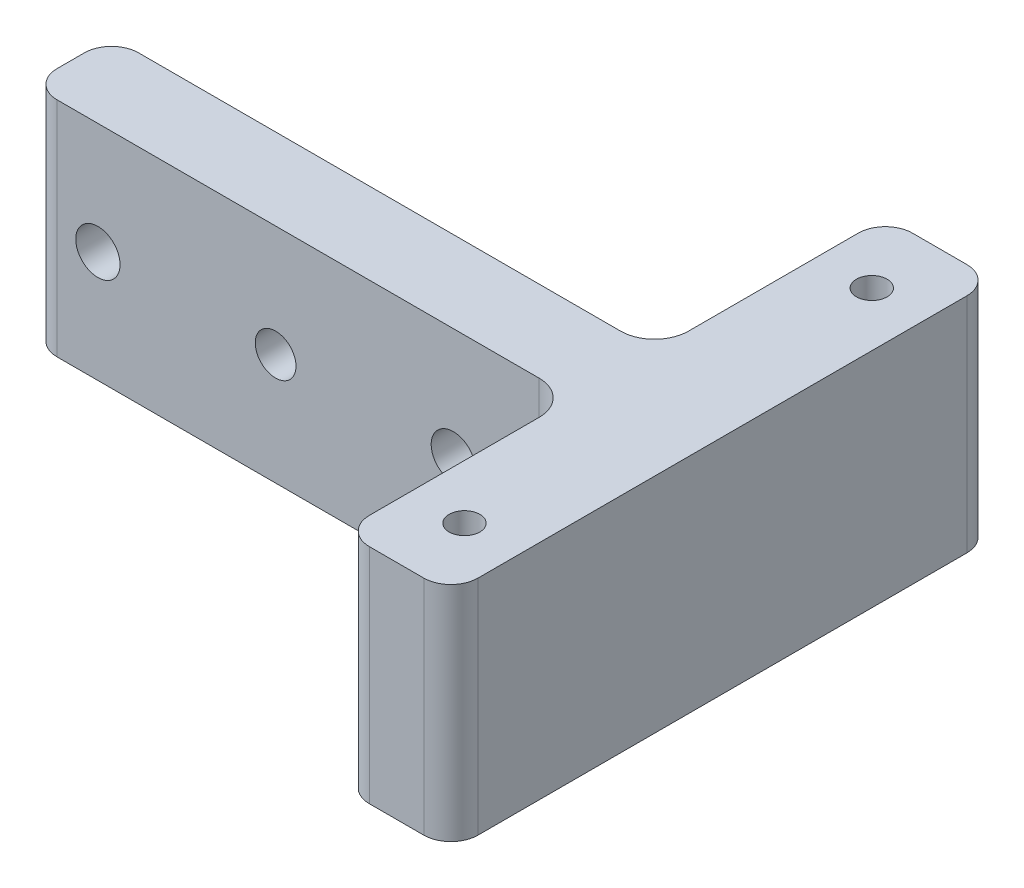
ISO-10303-21;
HEADER;
FILE_DESCRIPTION(('STEP AP214'),'2;1');
FILE_NAME('part.step','',(''),(''),'','','');
FILE_SCHEMA(('AUTOMOTIVE_DESIGN { 1 0 10303 214 1 1 1 1 }'));
ENDSEC;
DATA;
#1=APPLICATION_CONTEXT('core data for automotive mechanical design processes');
#2=APPLICATION_PROTOCOL_DEFINITION('international standard','automotive_design',2000,#1);
#3=PRODUCT_CONTEXT('',#1,'mechanical');
#4=PRODUCT('Part','Part','',(#3));
#5=PRODUCT_RELATED_PRODUCT_CATEGORY('part','',(#4));
#6=PRODUCT_DEFINITION_FORMATION('','',#4);
#7=PRODUCT_DEFINITION_CONTEXT('part definition',#1,'design');
#8=PRODUCT_DEFINITION('design','',#6,#7);
#9=PRODUCT_DEFINITION_SHAPE('','',#8);
#10=(LENGTH_UNIT() NAMED_UNIT(*) SI_UNIT(.MILLI.,.METRE.));
#11=(NAMED_UNIT(*) PLANE_ANGLE_UNIT() SI_UNIT($,.RADIAN.));
#12=(NAMED_UNIT(*) SI_UNIT($,.STERADIAN.) SOLID_ANGLE_UNIT());
#13=UNCERTAINTY_MEASURE_WITH_UNIT(LENGTH_MEASURE(1.E-05),#10,'distance_accuracy_value','');
#14=(GEOMETRIC_REPRESENTATION_CONTEXT(3) GLOBAL_UNCERTAINTY_ASSIGNED_CONTEXT((#13)) GLOBAL_UNIT_ASSIGNED_CONTEXT((#10,
#11,#12)) REPRESENTATION_CONTEXT('',''));
#15=CARTESIAN_POINT('',(0.,0.,0.));
#16=DIRECTION('',(0.,0.,1.));
#17=DIRECTION('',(1.,0.,0.));
#18=AXIS2_PLACEMENT_3D('',#15,#16,#17);
#19=CARTESIAN_POINT('',(4.,16.4,-20.));
#20=DIRECTION('',(-1.,0.,0.));
#21=DIRECTION('',(0.,0.,1.));
#22=AXIS2_PLACEMENT_3D('',#19,#20,#21);
#23=PLANE('',#22);
#24=DIRECTION('',(0.,0.,-1.));
#25=VECTOR('',#24,1.);
#26=CARTESIAN_POINT('',(4.,0.,-20.));
#27=LINE('',#26,#25);
#28=CARTESIAN_POINT('',(4.,0.,18.));
#29=VERTEX_POINT('',#28);
#30=CARTESIAN_POINT('',(4.,0.,-18.));
#31=VERTEX_POINT('',#30);
#32=EDGE_CURVE('E291',#29,#31,#27,.T.);
#33=ORIENTED_EDGE('',*,*,#32,.T.);
#34=DIRECTION('',(0.,-1.,0.));
#35=VECTOR('',#34,1.);
#36=CARTESIAN_POINT('',(4.,16.4,-18.));
#37=LINE('',#36,#35);
#38=CARTESIAN_POINT('',(4.,16.4,-18.));
#39=VERTEX_POINT('',#38);
#40=EDGE_CURVE('E243',#31,#39,#37,.F.);
#41=ORIENTED_EDGE('',*,*,#40,.T.);
#42=DIRECTION('',(0.,0.,-1.));
#43=VECTOR('',#42,1.);
#44=CARTESIAN_POINT('',(4.,16.4,-20.));
#45=LINE('',#44,#43);
#46=CARTESIAN_POINT('',(4.,16.4,18.));
#47=VERTEX_POINT('',#46);
#48=EDGE_CURVE('E192',#47,#39,#45,.T.);
#49=ORIENTED_EDGE('',*,*,#48,.F.);
#50=DIRECTION('',(0.,-1.,0.));
#51=VECTOR('',#50,1.);
#52=CARTESIAN_POINT('',(4.,16.4,18.));
#53=LINE('',#52,#51);
#54=EDGE_CURVE('E240',#47,#29,#53,.T.);
#55=ORIENTED_EDGE('',*,*,#54,.T.);
#56=EDGE_LOOP('',(#33,#41,#49,#55));
#57=FACE_BOUND('',#56,.T.);
#58=ADVANCED_FACE('F35',(#57),#23,.F.);
#59=CARTESIAN_POINT('',(-4.,16.4,-20.));
#60=DIRECTION('',(0.,0.,1.));
#61=DIRECTION('',(1.,0.,0.));
#62=AXIS2_PLACEMENT_3D('',#59,#60,#61);
#63=PLANE('',#62);
#64=DIRECTION('',(-1.,0.,0.));
#65=VECTOR('',#64,1.);
#66=CARTESIAN_POINT('',(-4.,0.,-20.));
#67=LINE('',#66,#65);
#68=CARTESIAN_POINT('',(2.,0.,-20.));
#69=VERTEX_POINT('',#68);
#70=CARTESIAN_POINT('',(-2.,0.,-20.));
#71=VERTEX_POINT('',#70);
#72=EDGE_CURVE('E182',#69,#71,#67,.T.);
#73=ORIENTED_EDGE('',*,*,#72,.T.);
#74=DIRECTION('',(0.,-1.,0.));
#75=VECTOR('',#74,1.);
#76=CARTESIAN_POINT('',(-2.,16.4,-20.));
#77=LINE('',#76,#75);
#78=CARTESIAN_POINT('',(-2.,16.4,-20.));
#79=VERTEX_POINT('',#78);
#80=EDGE_CURVE('E227',#71,#79,#77,.F.);
#81=ORIENTED_EDGE('',*,*,#80,.T.);
#82=DIRECTION('',(-1.,0.,0.));
#83=VECTOR('',#82,1.);
#84=CARTESIAN_POINT('',(-4.,16.4,-20.));
#85=LINE('',#84,#83);
#86=CARTESIAN_POINT('',(2.,16.4,-20.));
#87=VERTEX_POINT('',#86);
#88=EDGE_CURVE('E307',#87,#79,#85,.T.);
#89=ORIENTED_EDGE('',*,*,#88,.F.);
#90=DIRECTION('',(0.,-1.,0.));
#91=VECTOR('',#90,1.);
#92=CARTESIAN_POINT('',(2.,16.4,-20.));
#93=LINE('',#92,#91);
#94=EDGE_CURVE('E224',#87,#69,#93,.T.);
#95=ORIENTED_EDGE('',*,*,#94,.T.);
#96=EDGE_LOOP('',(#73,#81,#89,#95));
#97=FACE_BOUND('',#96,.T.);
#98=ADVANCED_FACE('F298',(#97),#63,.F.);
#99=CARTESIAN_POINT('',(-4.,16.4,-20.));
#100=DIRECTION('',(1.,0.,0.));
#101=DIRECTION('',(0.,0.,-1.));
#102=AXIS2_PLACEMENT_3D('',#99,#100,#101);
#103=PLANE('',#102);
#104=DIRECTION('',(0.,0.,1.));
#105=VECTOR('',#104,1.);
#106=CARTESIAN_POINT('',(-4.,16.4,-20.));
#107=LINE('',#106,#105);
#108=CARTESIAN_POINT('',(-4.,16.4,-18.));
#109=VERTEX_POINT('',#108);
#110=CARTESIAN_POINT('',(-4.,16.4,-5.5));
#111=VERTEX_POINT('',#110);
#112=EDGE_CURVE('E306',#109,#111,#107,.T.);
#113=ORIENTED_EDGE('',*,*,#112,.F.);
#114=DIRECTION('',(0.,-1.,0.));
#115=VECTOR('',#114,1.);
#116=CARTESIAN_POINT('',(-4.,16.4,-18.));
#117=LINE('',#116,#115);
#118=CARTESIAN_POINT('',(-4.,0.,-18.));
#119=VERTEX_POINT('',#118);
#120=EDGE_CURVE('E210',#109,#119,#117,.T.);
#121=ORIENTED_EDGE('',*,*,#120,.T.);
#122=DIRECTION('',(0.,0.,1.));
#123=VECTOR('',#122,1.);
#124=CARTESIAN_POINT('',(-4.,0.,-20.));
#125=LINE('',#124,#123);
#126=CARTESIAN_POINT('',(-4.,0.,-5.5));
#127=VERTEX_POINT('',#126);
#128=EDGE_CURVE('E177',#119,#127,#125,.T.);
#129=ORIENTED_EDGE('',*,*,#128,.T.);
#130=DIRECTION('',(0.,-1.,0.));
#131=VECTOR('',#130,1.);
#132=CARTESIAN_POINT('',(-4.,16.4,-5.5));
#133=LINE('',#132,#131);
#134=EDGE_CURVE('E156',#127,#111,#133,.F.);
#135=ORIENTED_EDGE('',*,*,#134,.T.);
#136=EDGE_LOOP('',(#113,#121,#129,#135));
#137=FACE_BOUND('',#136,.T.);
#138=ADVANCED_FACE('F309',(#137),#103,.F.);
#139=CARTESIAN_POINT('',(-4.,16.4,-3.));
#140=DIRECTION('',(0.,0.,1.));
#141=DIRECTION('',(1.,0.,0.));
#142=AXIS2_PLACEMENT_3D('',#139,#140,#141);
#143=PLANE('',#142);
#144=CARTESIAN_POINT('',(-39.,8.2,-3.));
#145=DIRECTION('',(0.,0.,1.));
#146=DIRECTION('',(1.,0.,0.));
#147=AXIS2_PLACEMENT_3D('',#144,#145,#146);
#148=CIRCLE('',#147,1.63195);
#149=CARTESIAN_POINT('',(-37.36805,8.2,-3.));
#150=VERTEX_POINT('',#149);
#151=EDGE_CURVE('E334',#150,#150,#148,.T.);
#152=ORIENTED_EDGE('',*,*,#151,.T.);
#153=EDGE_LOOP('',(#152));
#154=FACE_BOUND('',#153,.T.);
#155=CARTESIAN_POINT('',(-12.82,8.2,-3.));
#156=DIRECTION('',(0.,0.,1.));
#157=DIRECTION('',(1.,0.,0.));
#158=AXIS2_PLACEMENT_3D('',#155,#156,#157);
#159=CIRCLE('',#158,1.63195);
#160=CARTESIAN_POINT('',(-11.18805,8.2,-3.));
#161=VERTEX_POINT('',#160);
#162=EDGE_CURVE('E328',#161,#161,#159,.T.);
#163=ORIENTED_EDGE('',*,*,#162,.T.);
#164=EDGE_LOOP('',(#163));
#165=FACE_BOUND('',#164,.T.);
#166=CARTESIAN_POINT('',(-25.91,8.2,-3.));
#167=DIRECTION('',(0.,0.,1.));
#168=DIRECTION('',(1.,0.,0.));
#169=AXIS2_PLACEMENT_3D('',#166,#167,#168);
#170=CIRCLE('',#169,1.5);
#171=CARTESIAN_POINT('',(-24.41,8.2,-3.));
#172=VERTEX_POINT('',#171);
#173=EDGE_CURVE('E193',#172,#172,#170,.T.);
#174=ORIENTED_EDGE('',*,*,#173,.T.);
#175=EDGE_LOOP('',(#174));
#176=FACE_BOUND('',#175,.T.);
#177=DIRECTION('',(-1.,0.,0.));
#178=VECTOR('',#177,1.);
#179=CARTESIAN_POINT('',(-4.,0.,-3.));
#180=LINE('',#179,#178);
#181=CARTESIAN_POINT('',(-6.5,0.,-3.));
#182=VERTEX_POINT('',#181);
#183=CARTESIAN_POINT('',(-42.,0.,-3.));
#184=VERTEX_POINT('',#183);
#185=EDGE_CURVE('E167',#182,#184,#180,.T.);
#186=ORIENTED_EDGE('',*,*,#185,.T.);
#187=DIRECTION('',(0.,-1.,0.));
#188=VECTOR('',#187,1.);
#189=CARTESIAN_POINT('',(-42.,16.4,-3.));
#190=LINE('',#189,#188);
#191=CARTESIAN_POINT('',(-42.,16.4,-3.));
#192=VERTEX_POINT('',#191);
#193=EDGE_CURVE('E11',#184,#192,#190,.F.);
#194=ORIENTED_EDGE('',*,*,#193,.T.);
#195=DIRECTION('',(-1.,0.,0.));
#196=VECTOR('',#195,1.);
#197=CARTESIAN_POINT('',(-4.,16.4,-3.));
#198=LINE('',#197,#196);
#199=CARTESIAN_POINT('',(-6.5,16.4,-3.));
#200=VERTEX_POINT('',#199);
#201=EDGE_CURVE('E170',#200,#192,#198,.T.);
#202=ORIENTED_EDGE('',*,*,#201,.F.);
#203=DIRECTION('',(0.,-1.,0.));
#204=VECTOR('',#203,1.);
#205=CARTESIAN_POINT('',(-6.5,0.,-3.));
#206=LINE('',#205,#204);
#207=EDGE_CURVE('E154',#200,#182,#206,.T.);
#208=ORIENTED_EDGE('',*,*,#207,.T.);
#209=EDGE_LOOP('',(#186,#194,#202,#208));
#210=FACE_BOUND('',#209,.T.);
#211=ADVANCED_FACE('F166',(#154,#165,#176,#210),#143,.F.);
#212=CARTESIAN_POINT('',(-44.,16.4,3.00000000000001));
#213=DIRECTION('',(1.,0.,0.));
#214=DIRECTION('',(0.,0.,-1.));
#215=AXIS2_PLACEMENT_3D('',#212,#213,#214);
#216=PLANE('',#215);
#217=DIRECTION('',(0.,0.,1.));
#218=VECTOR('',#217,1.);
#219=CARTESIAN_POINT('',(-44.,0.,3.00000000000001));
#220=LINE('',#219,#218);
#221=CARTESIAN_POINT('',(-44.,0.,-0.999999999999996));
#222=VERTEX_POINT('',#221);
#223=CARTESIAN_POINT('',(-44.,0.,1.00000000000001));
#224=VERTEX_POINT('',#223);
#225=EDGE_CURVE('E176',#222,#224,#220,.T.);
#226=ORIENTED_EDGE('',*,*,#225,.T.);
#227=DIRECTION('',(0.,-1.,0.));
#228=VECTOR('',#227,1.);
#229=CARTESIAN_POINT('',(-44.,16.4,1.00000000000001));
#230=LINE('',#229,#228);
#231=CARTESIAN_POINT('',(-44.,16.4,1.00000000000001));
#232=VERTEX_POINT('',#231);
#233=EDGE_CURVE('E43',#224,#232,#230,.F.);
#234=ORIENTED_EDGE('',*,*,#233,.T.);
#235=DIRECTION('',(0.,0.,1.));
#236=VECTOR('',#235,1.);
#237=CARTESIAN_POINT('',(-44.,16.4,3.00000000000001));
#238=LINE('',#237,#236);
#239=CARTESIAN_POINT('',(-44.,16.4,-0.999999999999996));
#240=VERTEX_POINT('',#239);
#241=EDGE_CURVE('E261',#240,#232,#238,.T.);
#242=ORIENTED_EDGE('',*,*,#241,.F.);
#243=DIRECTION('',(0.,-1.,0.));
#244=VECTOR('',#243,1.);
#245=CARTESIAN_POINT('',(-44.,16.4,-0.999999999999996));
#246=LINE('',#245,#244);
#247=EDGE_CURVE('E254',#240,#222,#246,.T.);
#248=ORIENTED_EDGE('',*,*,#247,.T.);
#249=EDGE_LOOP('',(#226,#234,#242,#248));
#250=FACE_BOUND('',#249,.T.);
#251=ADVANCED_FACE('F260',(#250),#216,.F.);
#252=CARTESIAN_POINT('',(-4.,16.4,3.));
#253=DIRECTION('',(0.,0.,-1.));
#254=DIRECTION('',(-1.,0.,0.));
#255=AXIS2_PLACEMENT_3D('',#252,#253,#254);
#256=PLANE('',#255);
#257=CARTESIAN_POINT('',(-39.,8.2,3.));
#258=DIRECTION('',(0.,0.,1.));
#259=DIRECTION('',(1.,0.,0.));
#260=AXIS2_PLACEMENT_3D('',#257,#258,#259);
#261=CIRCLE('',#260,1.63195);
#262=CARTESIAN_POINT('',(-37.36805,8.2,3.));
#263=VERTEX_POINT('',#262);
#264=EDGE_CURVE('E337',#263,#263,#261,.T.);
#265=ORIENTED_EDGE('',*,*,#264,.F.);
#266=EDGE_LOOP('',(#265));
#267=FACE_BOUND('',#266,.T.);
#268=CARTESIAN_POINT('',(-12.82,8.2,3.));
#269=DIRECTION('',(0.,0.,1.));
#270=DIRECTION('',(1.,0.,0.));
#271=AXIS2_PLACEMENT_3D('',#268,#269,#270);
#272=CIRCLE('',#271,1.63195);
#273=CARTESIAN_POINT('',(-11.18805,8.2,3.));
#274=VERTEX_POINT('',#273);
#275=EDGE_CURVE('E331',#274,#274,#272,.T.);
#276=ORIENTED_EDGE('',*,*,#275,.F.);
#277=EDGE_LOOP('',(#276));
#278=FACE_BOUND('',#277,.T.);
#279=CARTESIAN_POINT('',(-25.91,8.2,3.));
#280=DIRECTION('',(0.,0.,1.));
#281=DIRECTION('',(1.,0.,0.));
#282=AXIS2_PLACEMENT_3D('',#279,#280,#281);
#283=CIRCLE('',#282,1.5);
#284=CARTESIAN_POINT('',(-24.41,8.2,3.));
#285=VERTEX_POINT('',#284);
#286=EDGE_CURVE('E196',#285,#285,#283,.T.);
#287=ORIENTED_EDGE('',*,*,#286,.F.);
#288=EDGE_LOOP('',(#287));
#289=FACE_BOUND('',#288,.T.);
#290=DIRECTION('',(1.,0.,0.));
#291=VECTOR('',#290,1.);
#292=CARTESIAN_POINT('',(-4.,16.4,3.));
#293=LINE('',#292,#291);
#294=CARTESIAN_POINT('',(-42.,16.4,3.00000000000001));
#295=VERTEX_POINT('',#294);
#296=CARTESIAN_POINT('',(-6.5,16.4,3.));
#297=VERTEX_POINT('',#296);
#298=EDGE_CURVE('E269',#295,#297,#293,.T.);
#299=ORIENTED_EDGE('',*,*,#298,.F.);
#300=DIRECTION('',(0.,-1.,0.));
#301=VECTOR('',#300,1.);
#302=CARTESIAN_POINT('',(-42.,16.4,3.00000000000001));
#303=LINE('',#302,#301);
#304=CARTESIAN_POINT('',(-42.,0.,3.00000000000001));
#305=VERTEX_POINT('',#304);
#306=EDGE_CURVE('E251',#295,#305,#303,.T.);
#307=ORIENTED_EDGE('',*,*,#306,.T.);
#308=DIRECTION('',(1.,0.,0.));
#309=VECTOR('',#308,1.);
#310=CARTESIAN_POINT('',(-4.,0.,3.));
#311=LINE('',#310,#309);
#312=CARTESIAN_POINT('',(-6.5,0.,3.));
#313=VERTEX_POINT('',#312);
#314=EDGE_CURVE('E180',#305,#313,#311,.T.);
#315=ORIENTED_EDGE('',*,*,#314,.T.);
#316=DIRECTION('',(0.,-1.,0.));
#317=VECTOR('',#316,1.);
#318=CARTESIAN_POINT('',(-6.5,16.4,3.));
#319=LINE('',#318,#317);
#320=EDGE_CURVE('E161',#313,#297,#319,.F.);
#321=ORIENTED_EDGE('',*,*,#320,.T.);
#322=EDGE_LOOP('',(#299,#307,#315,#321));
#323=FACE_BOUND('',#322,.T.);
#324=ADVANCED_FACE('F275',(#267,#278,#289,#323),#256,.F.);
#325=CARTESIAN_POINT('',(-4.,16.4,3.));
#326=DIRECTION('',(1.,0.,0.));
#327=DIRECTION('',(0.,0.,-1.));
#328=AXIS2_PLACEMENT_3D('',#325,#326,#327);
#329=PLANE('',#328);
#330=DIRECTION('',(0.,0.,1.));
#331=VECTOR('',#330,1.);
#332=CARTESIAN_POINT('',(-4.,0.,3.));
#333=LINE('',#332,#331);
#334=CARTESIAN_POINT('',(-4.,0.,5.5));
#335=VERTEX_POINT('',#334);
#336=CARTESIAN_POINT('',(-4.,0.,18.));
#337=VERTEX_POINT('',#336);
#338=EDGE_CURVE('E187',#335,#337,#333,.T.);
#339=ORIENTED_EDGE('',*,*,#338,.T.);
#340=DIRECTION('',(0.,-1.,0.));
#341=VECTOR('',#340,1.);
#342=CARTESIAN_POINT('',(-4.,16.4,18.));
#343=LINE('',#342,#341);
#344=CARTESIAN_POINT('',(-4.,16.4,18.));
#345=VERTEX_POINT('',#344);
#346=EDGE_CURVE('E249',#337,#345,#343,.F.);
#347=ORIENTED_EDGE('',*,*,#346,.T.);
#348=DIRECTION('',(0.,0.,1.));
#349=VECTOR('',#348,1.);
#350=CARTESIAN_POINT('',(-4.,16.4,3.));
#351=LINE('',#350,#349);
#352=CARTESIAN_POINT('',(-4.,16.4,5.5));
#353=VERTEX_POINT('',#352);
#354=EDGE_CURVE('E283',#353,#345,#351,.T.);
#355=ORIENTED_EDGE('',*,*,#354,.F.);
#356=DIRECTION('',(0.,-1.,0.));
#357=VECTOR('',#356,1.);
#358=CARTESIAN_POINT('',(-4.,0.,5.5));
#359=LINE('',#358,#357);
#360=EDGE_CURVE('E199',#353,#335,#359,.T.);
#361=ORIENTED_EDGE('',*,*,#360,.T.);
#362=EDGE_LOOP('',(#339,#347,#355,#361));
#363=FACE_BOUND('',#362,.T.);
#364=ADVANCED_FACE('F285',(#363),#329,.F.);
#365=CARTESIAN_POINT('',(-4.,16.4,20.));
#366=DIRECTION('',(0.,0.,-1.));
#367=DIRECTION('',(-1.,0.,0.));
#368=AXIS2_PLACEMENT_3D('',#365,#366,#367);
#369=PLANE('',#368);
#370=DIRECTION('',(1.,0.,0.));
#371=VECTOR('',#370,1.);
#372=CARTESIAN_POINT('',(-4.,16.4,20.));
#373=LINE('',#372,#371);
#374=CARTESIAN_POINT('',(-2.,16.4,20.));
#375=VERTEX_POINT('',#374);
#376=CARTESIAN_POINT('',(2.,16.4,20.));
#377=VERTEX_POINT('',#376);
#378=EDGE_CURVE('E171',#375,#377,#373,.T.);
#379=ORIENTED_EDGE('',*,*,#378,.F.);
#380=DIRECTION('',(0.,-1.,0.));
#381=VECTOR('',#380,1.);
#382=CARTESIAN_POINT('',(-2.,16.4,20.));
#383=LINE('',#382,#381);
#384=CARTESIAN_POINT('',(-2.,0.,20.));
#385=VERTEX_POINT('',#384);
#386=EDGE_CURVE('E246',#375,#385,#383,.T.);
#387=ORIENTED_EDGE('',*,*,#386,.T.);
#388=DIRECTION('',(1.,0.,0.));
#389=VECTOR('',#388,1.);
#390=CARTESIAN_POINT('',(-4.,0.,20.));
#391=LINE('',#390,#389);
#392=CARTESIAN_POINT('',(2.,0.,20.));
#393=VERTEX_POINT('',#392);
#394=EDGE_CURVE('E190',#385,#393,#391,.T.);
#395=ORIENTED_EDGE('',*,*,#394,.T.);
#396=DIRECTION('',(0.,-1.,0.));
#397=VECTOR('',#396,1.);
#398=CARTESIAN_POINT('',(2.,16.4,20.));
#399=LINE('',#398,#397);
#400=EDGE_CURVE('E50',#393,#377,#399,.F.);
#401=ORIENTED_EDGE('',*,*,#400,.T.);
#402=EDGE_LOOP('',(#379,#387,#395,#401));
#403=FACE_BOUND('',#402,.T.);
#404=ADVANCED_FACE('F448',(#403),#369,.F.);
#405=CARTESIAN_POINT('',(0.,16.4,0.));
#406=DIRECTION('',(0.,1.,0.));
#407=DIRECTION('',(0.,0.,1.));
#408=AXIS2_PLACEMENT_3D('',#405,#406,#407);
#409=PLANE('',#408);
#410=CARTESIAN_POINT('',(0.,16.4,-15.));
#411=DIRECTION('',(0.,1.,0.));
#412=DIRECTION('',(0.,0.,1.));
#413=AXIS2_PLACEMENT_3D('',#410,#411,#412);
#414=CIRCLE('',#413,1.1303);
#415=CARTESIAN_POINT('',(0.,16.4,-13.8697));
#416=VERTEX_POINT('',#415);
#417=EDGE_CURVE('E195',#416,#416,#414,.T.);
#418=ORIENTED_EDGE('',*,*,#417,.F.);
#419=EDGE_LOOP('',(#418));
#420=FACE_BOUND('',#419,.T.);
#421=CARTESIAN_POINT('',(0.,16.4,15.));
#422=DIRECTION('',(0.,1.,0.));
#423=DIRECTION('',(0.,0.,1.));
#424=AXIS2_PLACEMENT_3D('',#421,#422,#423);
#425=CIRCLE('',#424,1.1303);
#426=CARTESIAN_POINT('',(0.,16.4,16.1303));
#427=VERTEX_POINT('',#426);
#428=EDGE_CURVE('E318',#427,#427,#425,.T.);
#429=ORIENTED_EDGE('',*,*,#428,.F.);
#430=EDGE_LOOP('',(#429));
#431=FACE_BOUND('',#430,.T.);
#432=ORIENTED_EDGE('',*,*,#88,.T.);
#433=CARTESIAN_POINT('',(-2.,16.4,-18.));
#434=DIRECTION('',(0.,1.,0.));
#435=DIRECTION('',(0.,0.,1.));
#436=AXIS2_PLACEMENT_3D('',#433,#434,#435);
#437=CIRCLE('',#436,2.);
#438=EDGE_CURVE('E238',#79,#109,#437,.T.);
#439=ORIENTED_EDGE('',*,*,#438,.T.);
#440=ORIENTED_EDGE('',*,*,#112,.T.);
#441=CARTESIAN_POINT('',(-6.5,16.4,-5.5));
#442=DIRECTION('',(0.,1.,0.));
#443=DIRECTION('',(0.,0.,1.));
#444=AXIS2_PLACEMENT_3D('',#441,#442,#443);
#445=CIRCLE('',#444,2.5);
#446=EDGE_CURVE('E160',#111,#200,#445,.F.);
#447=ORIENTED_EDGE('',*,*,#446,.T.);
#448=ORIENTED_EDGE('',*,*,#201,.T.);
#449=CARTESIAN_POINT('',(-42.,16.4,-0.999999999999996));
#450=DIRECTION('',(0.,1.,0.));
#451=DIRECTION('',(0.,0.,1.));
#452=AXIS2_PLACEMENT_3D('',#449,#450,#451);
#453=CIRCLE('',#452,2.);
#454=EDGE_CURVE('E229',#192,#240,#453,.T.);
#455=ORIENTED_EDGE('',*,*,#454,.T.);
#456=ORIENTED_EDGE('',*,*,#241,.T.);
#457=CARTESIAN_POINT('',(-42.,16.4,1.00000000000001));
#458=DIRECTION('',(0.,1.,0.));
#459=DIRECTION('',(0.,0.,1.));
#460=AXIS2_PLACEMENT_3D('',#457,#458,#459);
#461=CIRCLE('',#460,2.);
#462=EDGE_CURVE('E231',#232,#295,#461,.T.);
#463=ORIENTED_EDGE('',*,*,#462,.T.);
#464=ORIENTED_EDGE('',*,*,#298,.T.);
#465=CARTESIAN_POINT('',(-6.5,16.4,5.5));
#466=DIRECTION('',(0.,1.,0.));
#467=DIRECTION('',(0.,0.,1.));
#468=AXIS2_PLACEMENT_3D('',#465,#466,#467);
#469=CIRCLE('',#468,2.5);
#470=EDGE_CURVE('E208',#297,#353,#469,.F.);
#471=ORIENTED_EDGE('',*,*,#470,.T.);
#472=ORIENTED_EDGE('',*,*,#354,.T.);
#473=CARTESIAN_POINT('',(-2.,16.4,18.));
#474=DIRECTION('',(0.,1.,0.));
#475=DIRECTION('',(0.,0.,1.));
#476=AXIS2_PLACEMENT_3D('',#473,#474,#475);
#477=CIRCLE('',#476,2.);
#478=EDGE_CURVE('E57',#345,#375,#477,.T.);
#479=ORIENTED_EDGE('',*,*,#478,.T.);
#480=ORIENTED_EDGE('',*,*,#378,.T.);
#481=CARTESIAN_POINT('',(2.,16.4,18.));
#482=DIRECTION('',(0.,1.,0.));
#483=DIRECTION('',(0.,0.,1.));
#484=AXIS2_PLACEMENT_3D('',#481,#482,#483);
#485=CIRCLE('',#484,2.);
#486=EDGE_CURVE('E233',#377,#47,#485,.T.);
#487=ORIENTED_EDGE('',*,*,#486,.T.);
#488=ORIENTED_EDGE('',*,*,#48,.T.);
#489=CARTESIAN_POINT('',(2.,16.4,-18.));
#490=DIRECTION('',(0.,1.,0.));
#491=DIRECTION('',(0.,0.,1.));
#492=AXIS2_PLACEMENT_3D('',#489,#490,#491);
#493=CIRCLE('',#492,2.);
#494=EDGE_CURVE('E236',#39,#87,#493,.T.);
#495=ORIENTED_EDGE('',*,*,#494,.T.);
#496=EDGE_LOOP('',(#432,#439,#440,#447,#448,#455,#456,#463,#464,#471,#472,#479,#480,#487,#488,#495));
#497=FACE_BOUND('',#496,.T.);
#498=ADVANCED_FACE('F266',(#420,#431,#497),#409,.T.);
#499=CARTESIAN_POINT('',(0.,0.,0.));
#500=DIRECTION('',(0.,1.,0.));
#501=DIRECTION('',(0.,0.,1.));
#502=AXIS2_PLACEMENT_3D('',#499,#500,#501);
#503=PLANE('',#502);
#504=CARTESIAN_POINT('',(0.,0.,-15.));
#505=DIRECTION('',(0.,1.,0.));
#506=DIRECTION('',(0.,0.,1.));
#507=AXIS2_PLACEMENT_3D('',#504,#505,#506);
#508=CIRCLE('',#507,1.1303);
#509=CARTESIAN_POINT('',(0.,0.,-13.8697));
#510=VERTEX_POINT('',#509);
#511=EDGE_CURVE('E321',#510,#510,#508,.T.);
#512=ORIENTED_EDGE('',*,*,#511,.T.);
#513=EDGE_LOOP('',(#512));
#514=FACE_BOUND('',#513,.T.);
#515=CARTESIAN_POINT('',(0.,0.,15.));
#516=DIRECTION('',(0.,1.,0.));
#517=DIRECTION('',(0.,0.,1.));
#518=AXIS2_PLACEMENT_3D('',#515,#516,#517);
#519=CIRCLE('',#518,1.1303);
#520=CARTESIAN_POINT('',(0.,0.,16.1303));
#521=VERTEX_POINT('',#520);
#522=EDGE_CURVE('E293',#521,#521,#519,.T.);
#523=ORIENTED_EDGE('',*,*,#522,.T.);
#524=EDGE_LOOP('',(#523));
#525=FACE_BOUND('',#524,.T.);
#526=ORIENTED_EDGE('',*,*,#128,.F.);
#527=CARTESIAN_POINT('',(-2.,0.,-18.));
#528=DIRECTION('',(0.,1.,0.));
#529=DIRECTION('',(0.,0.,1.));
#530=AXIS2_PLACEMENT_3D('',#527,#528,#529);
#531=CIRCLE('',#530,2.);
#532=EDGE_CURVE('E222',#119,#71,#531,.F.);
#533=ORIENTED_EDGE('',*,*,#532,.T.);
#534=ORIENTED_EDGE('',*,*,#72,.F.);
#535=CARTESIAN_POINT('',(2.,0.,-18.));
#536=DIRECTION('',(0.,1.,0.));
#537=DIRECTION('',(0.,0.,1.));
#538=AXIS2_PLACEMENT_3D('',#535,#536,#537);
#539=CIRCLE('',#538,2.);
#540=EDGE_CURVE('E220',#69,#31,#539,.F.);
#541=ORIENTED_EDGE('',*,*,#540,.T.);
#542=ORIENTED_EDGE('',*,*,#32,.F.);
#543=CARTESIAN_POINT('',(2.,0.,18.));
#544=DIRECTION('',(0.,1.,0.));
#545=DIRECTION('',(0.,0.,1.));
#546=AXIS2_PLACEMENT_3D('',#543,#544,#545);
#547=CIRCLE('',#546,2.);
#548=EDGE_CURVE('E216',#29,#393,#547,.F.);
#549=ORIENTED_EDGE('',*,*,#548,.T.);
#550=ORIENTED_EDGE('',*,*,#394,.F.);
#551=CARTESIAN_POINT('',(-2.,0.,18.));
#552=DIRECTION('',(0.,1.,0.));
#553=DIRECTION('',(0.,0.,1.));
#554=AXIS2_PLACEMENT_3D('',#551,#552,#553);
#555=CIRCLE('',#554,2.);
#556=EDGE_CURVE('E218',#385,#337,#555,.F.);
#557=ORIENTED_EDGE('',*,*,#556,.T.);
#558=ORIENTED_EDGE('',*,*,#338,.F.);
#559=CARTESIAN_POINT('',(-6.5,0.,5.5));
#560=DIRECTION('',(0.,1.,0.));
#561=DIRECTION('',(0.,0.,1.));
#562=AXIS2_PLACEMENT_3D('',#559,#560,#561);
#563=CIRCLE('',#562,2.5);
#564=EDGE_CURVE('E205',#335,#313,#563,.T.);
#565=ORIENTED_EDGE('',*,*,#564,.T.);
#566=ORIENTED_EDGE('',*,*,#314,.F.);
#567=CARTESIAN_POINT('',(-42.,0.,1.00000000000001));
#568=DIRECTION('',(0.,1.,0.));
#569=DIRECTION('',(0.,0.,1.));
#570=AXIS2_PLACEMENT_3D('',#567,#568,#569);
#571=CIRCLE('',#570,2.);
#572=EDGE_CURVE('E214',#305,#224,#571,.F.);
#573=ORIENTED_EDGE('',*,*,#572,.T.);
#574=ORIENTED_EDGE('',*,*,#225,.F.);
#575=CARTESIAN_POINT('',(-42.,0.,-0.999999999999996));
#576=DIRECTION('',(0.,1.,0.));
#577=DIRECTION('',(0.,0.,1.));
#578=AXIS2_PLACEMENT_3D('',#575,#576,#577);
#579=CIRCLE('',#578,2.);
#580=EDGE_CURVE('E175',#222,#184,#579,.F.);
#581=ORIENTED_EDGE('',*,*,#580,.T.);
#582=ORIENTED_EDGE('',*,*,#185,.F.);
#583=CARTESIAN_POINT('',(-6.5,0.,-5.5));
#584=DIRECTION('',(0.,1.,0.));
#585=DIRECTION('',(0.,0.,1.));
#586=AXIS2_PLACEMENT_3D('',#583,#584,#585);
#587=CIRCLE('',#586,2.5);
#588=EDGE_CURVE('E150',#182,#127,#587,.T.);
#589=ORIENTED_EDGE('',*,*,#588,.T.);
#590=EDGE_LOOP('',(#526,#533,#534,#541,#542,#549,#550,#557,#558,#565,#566,#573,#574,#581,#582,#589));
#591=FACE_BOUND('',#590,.T.);
#592=ADVANCED_FACE('F173',(#514,#525,#591),#503,.F.);
#593=CARTESIAN_POINT('',(0.,16.4,15.));
#594=DIRECTION('',(0.,1.,0.));
#595=DIRECTION('',(0.,0.,1.));
#596=AXIS2_PLACEMENT_3D('',#593,#594,#595);
#597=CYLINDRICAL_SURFACE('',#596,1.1303);
#598=ORIENTED_EDGE('',*,*,#522,.F.);
#599=EDGE_LOOP('',(#598));
#600=FACE_BOUND('',#599,.T.);
#601=ORIENTED_EDGE('',*,*,#428,.T.);
#602=EDGE_LOOP('',(#601));
#603=FACE_BOUND('',#602,.T.);
#604=ADVANCED_FACE('F439',(#600,#603),#597,.F.);
#605=CARTESIAN_POINT('',(0.,16.4,-15.));
#606=DIRECTION('',(0.,1.,0.));
#607=DIRECTION('',(0.,0.,1.));
#608=AXIS2_PLACEMENT_3D('',#605,#606,#607);
#609=CYLINDRICAL_SURFACE('',#608,1.1303);
#610=ORIENTED_EDGE('',*,*,#511,.F.);
#611=EDGE_LOOP('',(#610));
#612=FACE_BOUND('',#611,.T.);
#613=ORIENTED_EDGE('',*,*,#417,.T.);
#614=EDGE_LOOP('',(#613));
#615=FACE_BOUND('',#614,.T.);
#616=ADVANCED_FACE('F355',(#612,#615),#609,.F.);
#617=CARTESIAN_POINT('',(-25.91,8.2,3.));
#618=DIRECTION('',(0.,0.,1.));
#619=DIRECTION('',(1.,0.,0.));
#620=AXIS2_PLACEMENT_3D('',#617,#618,#619);
#621=CYLINDRICAL_SURFACE('',#620,1.5);
#622=ORIENTED_EDGE('',*,*,#286,.T.);
#623=EDGE_LOOP('',(#622));
#624=FACE_BOUND('',#623,.T.);
#625=ORIENTED_EDGE('',*,*,#173,.F.);
#626=EDGE_LOOP('',(#625));
#627=FACE_BOUND('',#626,.T.);
#628=ADVANCED_FACE('F351',(#624,#627),#621,.F.);
#629=CARTESIAN_POINT('',(-12.82,8.2,3.));
#630=DIRECTION('',(0.,0.,1.));
#631=DIRECTION('',(1.,0.,0.));
#632=AXIS2_PLACEMENT_3D('',#629,#630,#631);
#633=CYLINDRICAL_SURFACE('',#632,1.63195);
#634=ORIENTED_EDGE('',*,*,#275,.T.);
#635=EDGE_LOOP('',(#634));
#636=FACE_BOUND('',#635,.T.);
#637=ORIENTED_EDGE('',*,*,#162,.F.);
#638=EDGE_LOOP('',(#637));
#639=FACE_BOUND('',#638,.T.);
#640=ADVANCED_FACE('F354',(#636,#639),#633,.F.);
#641=CARTESIAN_POINT('',(-39.,8.2,3.));
#642=DIRECTION('',(0.,0.,1.));
#643=DIRECTION('',(1.,0.,0.));
#644=AXIS2_PLACEMENT_3D('',#641,#642,#643);
#645=CYLINDRICAL_SURFACE('',#644,1.63195);
#646=ORIENTED_EDGE('',*,*,#264,.T.);
#647=EDGE_LOOP('',(#646));
#648=FACE_BOUND('',#647,.T.);
#649=ORIENTED_EDGE('',*,*,#151,.F.);
#650=EDGE_LOOP('',(#649));
#651=FACE_BOUND('',#650,.T.);
#652=ADVANCED_FACE('F341',(#648,#651),#645,.F.);
#653=CARTESIAN_POINT('',(-6.5,16.4,-5.5));
#654=DIRECTION('',(0.,1.,0.));
#655=DIRECTION('',(0.,0.,1.));
#656=AXIS2_PLACEMENT_3D('',#653,#654,#655);
#657=CYLINDRICAL_SURFACE('',#656,2.5);
#658=ORIENTED_EDGE('',*,*,#446,.F.);
#659=ORIENTED_EDGE('',*,*,#134,.F.);
#660=ORIENTED_EDGE('',*,*,#588,.F.);
#661=ORIENTED_EDGE('',*,*,#207,.F.);
#662=EDGE_LOOP('',(#658,#659,#660,#661));
#663=FACE_BOUND('',#662,.T.);
#664=ADVANCED_FACE('F153',(#663),#657,.F.);
#665=CARTESIAN_POINT('',(-6.5,16.4,5.5));
#666=DIRECTION('',(0.,1.,0.));
#667=DIRECTION('',(0.,0.,1.));
#668=AXIS2_PLACEMENT_3D('',#665,#666,#667);
#669=CYLINDRICAL_SURFACE('',#668,2.5);
#670=ORIENTED_EDGE('',*,*,#470,.F.);
#671=ORIENTED_EDGE('',*,*,#320,.F.);
#672=ORIENTED_EDGE('',*,*,#564,.F.);
#673=ORIENTED_EDGE('',*,*,#360,.F.);
#674=EDGE_LOOP('',(#670,#671,#672,#673));
#675=FACE_BOUND('',#674,.T.);
#676=ADVANCED_FACE('F281',(#675),#669,.F.);
#677=CARTESIAN_POINT('',(-2.,16.4,-18.));
#678=DIRECTION('',(0.,-1.,0.));
#679=DIRECTION('',(0.,0.,-1.));
#680=AXIS2_PLACEMENT_3D('',#677,#678,#679);
#681=CYLINDRICAL_SURFACE('',#680,2.);
#682=ORIENTED_EDGE('',*,*,#438,.F.);
#683=ORIENTED_EDGE('',*,*,#80,.F.);
#684=ORIENTED_EDGE('',*,*,#532,.F.);
#685=ORIENTED_EDGE('',*,*,#120,.F.);
#686=EDGE_LOOP('',(#682,#683,#684,#685));
#687=FACE_BOUND('',#686,.T.);
#688=ADVANCED_FACE('F303',(#687),#681,.T.);
#689=CARTESIAN_POINT('',(2.,16.4,-18.));
#690=DIRECTION('',(0.,-1.,0.));
#691=DIRECTION('',(0.,0.,-1.));
#692=AXIS2_PLACEMENT_3D('',#689,#690,#691);
#693=CYLINDRICAL_SURFACE('',#692,2.);
#694=ORIENTED_EDGE('',*,*,#494,.F.);
#695=ORIENTED_EDGE('',*,*,#40,.F.);
#696=ORIENTED_EDGE('',*,*,#540,.F.);
#697=ORIENTED_EDGE('',*,*,#94,.F.);
#698=EDGE_LOOP('',(#694,#695,#696,#697));
#699=FACE_BOUND('',#698,.T.);
#700=ADVANCED_FACE('F384',(#699),#693,.T.);
#701=CARTESIAN_POINT('',(-2.,16.4,18.));
#702=DIRECTION('',(0.,-1.,0.));
#703=DIRECTION('',(0.,0.,-1.));
#704=AXIS2_PLACEMENT_3D('',#701,#702,#703);
#705=CYLINDRICAL_SURFACE('',#704,2.);
#706=ORIENTED_EDGE('',*,*,#478,.F.);
#707=ORIENTED_EDGE('',*,*,#346,.F.);
#708=ORIENTED_EDGE('',*,*,#556,.F.);
#709=ORIENTED_EDGE('',*,*,#386,.F.);
#710=EDGE_LOOP('',(#706,#707,#708,#709));
#711=FACE_BOUND('',#710,.T.);
#712=ADVANCED_FACE('F387',(#711),#705,.T.);
#713=CARTESIAN_POINT('',(2.,16.4,18.));
#714=DIRECTION('',(0.,-1.,0.));
#715=DIRECTION('',(0.,0.,-1.));
#716=AXIS2_PLACEMENT_3D('',#713,#714,#715);
#717=CYLINDRICAL_SURFACE('',#716,2.);
#718=ORIENTED_EDGE('',*,*,#486,.F.);
#719=ORIENTED_EDGE('',*,*,#400,.F.);
#720=ORIENTED_EDGE('',*,*,#548,.F.);
#721=ORIENTED_EDGE('',*,*,#54,.F.);
#722=EDGE_LOOP('',(#718,#719,#720,#721));
#723=FACE_BOUND('',#722,.T.);
#724=ADVANCED_FACE('F391',(#723),#717,.T.);
#725=CARTESIAN_POINT('',(-42.,16.4,1.00000000000001));
#726=DIRECTION('',(0.,-1.,0.));
#727=DIRECTION('',(0.,0.,-1.));
#728=AXIS2_PLACEMENT_3D('',#725,#726,#727);
#729=CYLINDRICAL_SURFACE('',#728,2.);
#730=ORIENTED_EDGE('',*,*,#462,.F.);
#731=ORIENTED_EDGE('',*,*,#233,.F.);
#732=ORIENTED_EDGE('',*,*,#572,.F.);
#733=ORIENTED_EDGE('',*,*,#306,.F.);
#734=EDGE_LOOP('',(#730,#731,#732,#733));
#735=FACE_BOUND('',#734,.T.);
#736=ADVANCED_FACE('F272',(#735),#729,.T.);
#737=CARTESIAN_POINT('',(-42.,16.4,-0.999999999999996));
#738=DIRECTION('',(0.,-1.,0.));
#739=DIRECTION('',(0.,0.,-1.));
#740=AXIS2_PLACEMENT_3D('',#737,#738,#739);
#741=CYLINDRICAL_SURFACE('',#740,2.);
#742=ORIENTED_EDGE('',*,*,#454,.F.);
#743=ORIENTED_EDGE('',*,*,#193,.F.);
#744=ORIENTED_EDGE('',*,*,#580,.F.);
#745=ORIENTED_EDGE('',*,*,#247,.F.);
#746=EDGE_LOOP('',(#742,#743,#744,#745));
#747=FACE_BOUND('',#746,.T.);
#748=ADVANCED_FACE('F37',(#747),#741,.T.);
#749=CLOSED_SHELL('',(#58,#98,#138,#211,#251,#324,#364,#404,#498,#592,#604,#616,#628,#640,#652,
#664,#676,#688,#700,#712,#724,#736,#748));
#750=MANIFOLD_SOLID_BREP('B2',#749);
#751=ADVANCED_BREP_SHAPE_REPRESENTATION('',(#18,#750),#14);
#752=SHAPE_DEFINITION_REPRESENTATION(#9,#751);
ENDSEC;
END-ISO-10303-21;
